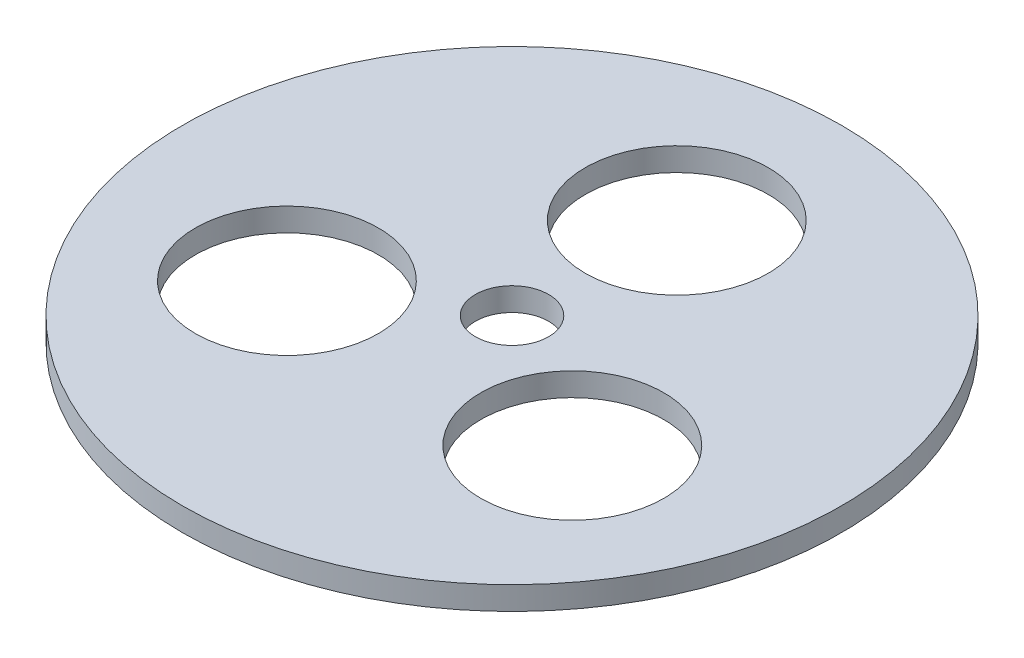
ISO-10303-21;
HEADER;
FILE_DESCRIPTION(('STEP AP214'),'2;1');
FILE_NAME('part.step','',(''),(''),'','','');
FILE_SCHEMA(('AUTOMOTIVE_DESIGN { 1 0 10303 214 1 1 1 1 }'));
ENDSEC;
DATA;
#1=APPLICATION_CONTEXT('core data for automotive mechanical design processes');
#2=APPLICATION_PROTOCOL_DEFINITION('international standard','automotive_design',2000,#1);
#3=PRODUCT_CONTEXT('',#1,'mechanical');
#4=PRODUCT('Part','Part','',(#3));
#5=PRODUCT_RELATED_PRODUCT_CATEGORY('part','',(#4));
#6=PRODUCT_DEFINITION_FORMATION('','',#4);
#7=PRODUCT_DEFINITION_CONTEXT('part definition',#1,'design');
#8=PRODUCT_DEFINITION('design','',#6,#7);
#9=PRODUCT_DEFINITION_SHAPE('','',#8);
#10=(LENGTH_UNIT() NAMED_UNIT(*) SI_UNIT(.MILLI.,.METRE.));
#11=(NAMED_UNIT(*) PLANE_ANGLE_UNIT() SI_UNIT($,.RADIAN.));
#12=(NAMED_UNIT(*) SI_UNIT($,.STERADIAN.) SOLID_ANGLE_UNIT());
#13=UNCERTAINTY_MEASURE_WITH_UNIT(LENGTH_MEASURE(1.E-05),#10,'distance_accuracy_value','');
#14=(GEOMETRIC_REPRESENTATION_CONTEXT(3) GLOBAL_UNCERTAINTY_ASSIGNED_CONTEXT((#13)) GLOBAL_UNIT_ASSIGNED_CONTEXT((#10,
#11,#12)) REPRESENTATION_CONTEXT('',''));
#15=CARTESIAN_POINT('',(0.,0.,0.));
#16=DIRECTION('',(0.,0.,1.));
#17=DIRECTION('',(1.,0.,0.));
#18=AXIS2_PLACEMENT_3D('',#15,#16,#17);
#19=CARTESIAN_POINT('',(0.,3.175,0.));
#20=DIRECTION('',(0.,1.,0.));
#21=DIRECTION('',(0.,0.,1.));
#22=AXIS2_PLACEMENT_3D('',#19,#20,#21);
#23=PLANE('',#22);
#24=CARTESIAN_POINT('',(0.,3.175,0.));
#25=DIRECTION('',(0.,1.,0.));
#26=DIRECTION('',(0.,0.,1.));
#27=AXIS2_PLACEMENT_3D('',#24,#25,#26);
#28=CIRCLE('',#27,5.);
#29=CARTESIAN_POINT('',(0.,3.175,5.));
#30=VERTEX_POINT('',#29);
#31=EDGE_CURVE('E63',#30,#30,#28,.T.);
#32=ORIENTED_EDGE('',*,*,#31,.F.);
#33=EDGE_LOOP('',(#32));
#34=FACE_BOUND('',#33,.T.);
#35=CARTESIAN_POINT('',(19.4855715851498,3.175,11.2500000000001));
#36=DIRECTION('',(0.,1.,0.));
#37=DIRECTION('',(0.,0.,1.));
#38=AXIS2_PLACEMENT_3D('',#35,#36,#37);
#39=CIRCLE('',#38,12.5);
#40=CARTESIAN_POINT('',(19.4855715851498,3.175,23.7500000000001));
#41=VERTEX_POINT('',#40);
#42=EDGE_CURVE('E49',#41,#41,#39,.T.);
#43=ORIENTED_EDGE('',*,*,#42,.F.);
#44=EDGE_LOOP('',(#43));
#45=FACE_BOUND('',#44,.T.);
#46=CARTESIAN_POINT('',(0.,3.175,0.));
#47=DIRECTION('',(0.,1.,0.));
#48=DIRECTION('',(0.,0.,1.));
#49=AXIS2_PLACEMENT_3D('',#46,#47,#48);
#50=CIRCLE('',#49,45.);
#51=CARTESIAN_POINT('',(0.,3.175,45.));
#52=VERTEX_POINT('',#51);
#53=EDGE_CURVE('E10',#52,#52,#50,.T.);
#54=ORIENTED_EDGE('',*,*,#53,.T.);
#55=EDGE_LOOP('',(#54));
#56=FACE_BOUND('',#55,.T.);
#57=CARTESIAN_POINT('',(0.,3.175,-22.5));
#58=DIRECTION('',(0.,1.,0.));
#59=DIRECTION('',(0.,0.,1.));
#60=AXIS2_PLACEMENT_3D('',#57,#58,#59);
#61=CIRCLE('',#60,12.5);
#62=CARTESIAN_POINT('',(0.,3.175,-10.));
#63=VERTEX_POINT('',#62);
#64=EDGE_CURVE('E44',#63,#63,#61,.T.);
#65=ORIENTED_EDGE('',*,*,#64,.F.);
#66=EDGE_LOOP('',(#65));
#67=FACE_BOUND('',#66,.T.);
#68=CARTESIAN_POINT('',(-19.48557158515,3.175,11.2499999999998));
#69=DIRECTION('',(0.,1.,0.));
#70=DIRECTION('',(0.,0.,1.));
#71=AXIS2_PLACEMENT_3D('',#68,#69,#70);
#72=CIRCLE('',#71,12.5);
#73=CARTESIAN_POINT('',(-19.48557158515,3.175,23.7499999999998));
#74=VERTEX_POINT('',#73);
#75=EDGE_CURVE('E55',#74,#74,#72,.T.);
#76=ORIENTED_EDGE('',*,*,#75,.F.);
#77=EDGE_LOOP('',(#76));
#78=FACE_BOUND('',#77,.T.);
#79=ADVANCED_FACE('F31',(#34,#45,#56,#67,#78),#23,.T.);
#80=CARTESIAN_POINT('',(0.,0.,0.));
#81=DIRECTION('',(0.,1.,0.));
#82=DIRECTION('',(0.,0.,1.));
#83=AXIS2_PLACEMENT_3D('',#80,#81,#82);
#84=PLANE('',#83);
#85=CARTESIAN_POINT('',(0.,0.,0.));
#86=DIRECTION('',(0.,1.,0.));
#87=DIRECTION('',(0.,0.,1.));
#88=AXIS2_PLACEMENT_3D('',#85,#86,#87);
#89=CIRCLE('',#88,5.);
#90=CARTESIAN_POINT('',(0.,0.,5.));
#91=VERTEX_POINT('',#90);
#92=EDGE_CURVE('E35',#91,#91,#89,.T.);
#93=ORIENTED_EDGE('',*,*,#92,.T.);
#94=EDGE_LOOP('',(#93));
#95=FACE_BOUND('',#94,.T.);
#96=CARTESIAN_POINT('',(0.,0.,0.));
#97=DIRECTION('',(0.,1.,0.));
#98=DIRECTION('',(0.,0.,1.));
#99=AXIS2_PLACEMENT_3D('',#96,#97,#98);
#100=CIRCLE('',#99,45.);
#101=CARTESIAN_POINT('',(0.,0.,45.));
#102=VERTEX_POINT('',#101);
#103=EDGE_CURVE('E39',#102,#102,#100,.T.);
#104=ORIENTED_EDGE('',*,*,#103,.F.);
#105=EDGE_LOOP('',(#104));
#106=FACE_BOUND('',#105,.T.);
#107=CARTESIAN_POINT('',(0.,0.,-22.5));
#108=DIRECTION('',(0.,1.,0.));
#109=DIRECTION('',(0.,0.,1.));
#110=AXIS2_PLACEMENT_3D('',#107,#108,#109);
#111=CIRCLE('',#110,12.5);
#112=CARTESIAN_POINT('',(0.,0.,-10.));
#113=VERTEX_POINT('',#112);
#114=EDGE_CURVE('E46',#113,#113,#111,.T.);
#115=ORIENTED_EDGE('',*,*,#114,.T.);
#116=EDGE_LOOP('',(#115));
#117=FACE_BOUND('',#116,.T.);
#118=CARTESIAN_POINT('',(19.4855715851498,0.,11.2500000000001));
#119=DIRECTION('',(0.,1.,0.));
#120=DIRECTION('',(0.,0.,1.));
#121=AXIS2_PLACEMENT_3D('',#118,#119,#120);
#122=CIRCLE('',#121,12.5);
#123=CARTESIAN_POINT('',(19.4855715851498,0.,23.7500000000001));
#124=VERTEX_POINT('',#123);
#125=EDGE_CURVE('E52',#124,#124,#122,.T.);
#126=ORIENTED_EDGE('',*,*,#125,.T.);
#127=EDGE_LOOP('',(#126));
#128=FACE_BOUND('',#127,.T.);
#129=CARTESIAN_POINT('',(-19.48557158515,0.,11.2499999999998));
#130=DIRECTION('',(0.,1.,0.));
#131=DIRECTION('',(0.,0.,1.));
#132=AXIS2_PLACEMENT_3D('',#129,#130,#131);
#133=CIRCLE('',#132,12.5);
#134=CARTESIAN_POINT('',(-19.48557158515,0.,23.7499999999998));
#135=VERTEX_POINT('',#134);
#136=EDGE_CURVE('E58',#135,#135,#133,.T.);
#137=ORIENTED_EDGE('',*,*,#136,.T.);
#138=EDGE_LOOP('',(#137));
#139=FACE_BOUND('',#138,.T.);
#140=ADVANCED_FACE('F70',(#95,#106,#117,#128,#139),#84,.F.);
#141=CARTESIAN_POINT('',(0.,3.175,0.));
#142=DIRECTION('',(0.,-1.,0.));
#143=DIRECTION('',(0.,0.,-1.));
#144=AXIS2_PLACEMENT_3D('',#141,#142,#143);
#145=CYLINDRICAL_SURFACE('',#144,45.);
#146=ORIENTED_EDGE('',*,*,#53,.F.);
#147=EDGE_LOOP('',(#146));
#148=FACE_BOUND('',#147,.T.);
#149=ORIENTED_EDGE('',*,*,#103,.T.);
#150=EDGE_LOOP('',(#149));
#151=FACE_BOUND('',#150,.T.);
#152=ADVANCED_FACE('F33',(#148,#151),#145,.T.);
#153=CARTESIAN_POINT('',(0.,3.175,-22.5));
#154=DIRECTION('',(0.,-1.,0.));
#155=DIRECTION('',(0.,0.,-1.));
#156=AXIS2_PLACEMENT_3D('',#153,#154,#155);
#157=CYLINDRICAL_SURFACE('',#156,12.5);
#158=ORIENTED_EDGE('',*,*,#64,.T.);
#159=EDGE_LOOP('',(#158));
#160=FACE_BOUND('',#159,.T.);
#161=ORIENTED_EDGE('',*,*,#114,.F.);
#162=EDGE_LOOP('',(#161));
#163=FACE_BOUND('',#162,.T.);
#164=ADVANCED_FACE('F91',(#160,#163),#157,.F.);
#165=CARTESIAN_POINT('',(19.4855715851498,3.175,11.2500000000001));
#166=DIRECTION('',(0.,-1.,0.));
#167=DIRECTION('',(0.,0.,-1.));
#168=AXIS2_PLACEMENT_3D('',#165,#166,#167);
#169=CYLINDRICAL_SURFACE('',#168,12.5);
#170=ORIENTED_EDGE('',*,*,#42,.T.);
#171=EDGE_LOOP('',(#170));
#172=FACE_BOUND('',#171,.T.);
#173=ORIENTED_EDGE('',*,*,#125,.F.);
#174=EDGE_LOOP('',(#173));
#175=FACE_BOUND('',#174,.T.);
#176=ADVANCED_FACE('F80',(#172,#175),#169,.F.);
#177=CARTESIAN_POINT('',(-19.48557158515,3.175,11.2499999999998));
#178=DIRECTION('',(0.,-1.,0.));
#179=DIRECTION('',(0.,0.,-1.));
#180=AXIS2_PLACEMENT_3D('',#177,#178,#179);
#181=CYLINDRICAL_SURFACE('',#180,12.5);
#182=ORIENTED_EDGE('',*,*,#75,.T.);
#183=EDGE_LOOP('',(#182));
#184=FACE_BOUND('',#183,.T.);
#185=ORIENTED_EDGE('',*,*,#136,.F.);
#186=EDGE_LOOP('',(#185));
#187=FACE_BOUND('',#186,.T.);
#188=ADVANCED_FACE('F75',(#184,#187),#181,.F.);
#189=CARTESIAN_POINT('',(0.,-3.175,0.));
#190=DIRECTION('',(0.,1.,0.));
#191=DIRECTION('',(0.,0.,1.));
#192=AXIS2_PLACEMENT_3D('',#189,#190,#191);
#193=CYLINDRICAL_SURFACE('',#192,5.);
#194=ORIENTED_EDGE('',*,*,#31,.T.);
#195=EDGE_LOOP('',(#194));
#196=FACE_BOUND('',#195,.T.);
#197=ORIENTED_EDGE('',*,*,#92,.F.);
#198=EDGE_LOOP('',(#197));
#199=FACE_BOUND('',#198,.T.);
#200=ADVANCED_FACE('F73',(#196,#199),#193,.F.);
#201=CLOSED_SHELL('',(#79,#140,#152,#164,#176,#188,#200));
#202=MANIFOLD_SOLID_BREP('B2',#201);
#203=ADVANCED_BREP_SHAPE_REPRESENTATION('',(#18,#202),#14);
#204=SHAPE_DEFINITION_REPRESENTATION(#9,#203);
ENDSEC;
END-ISO-10303-21;
